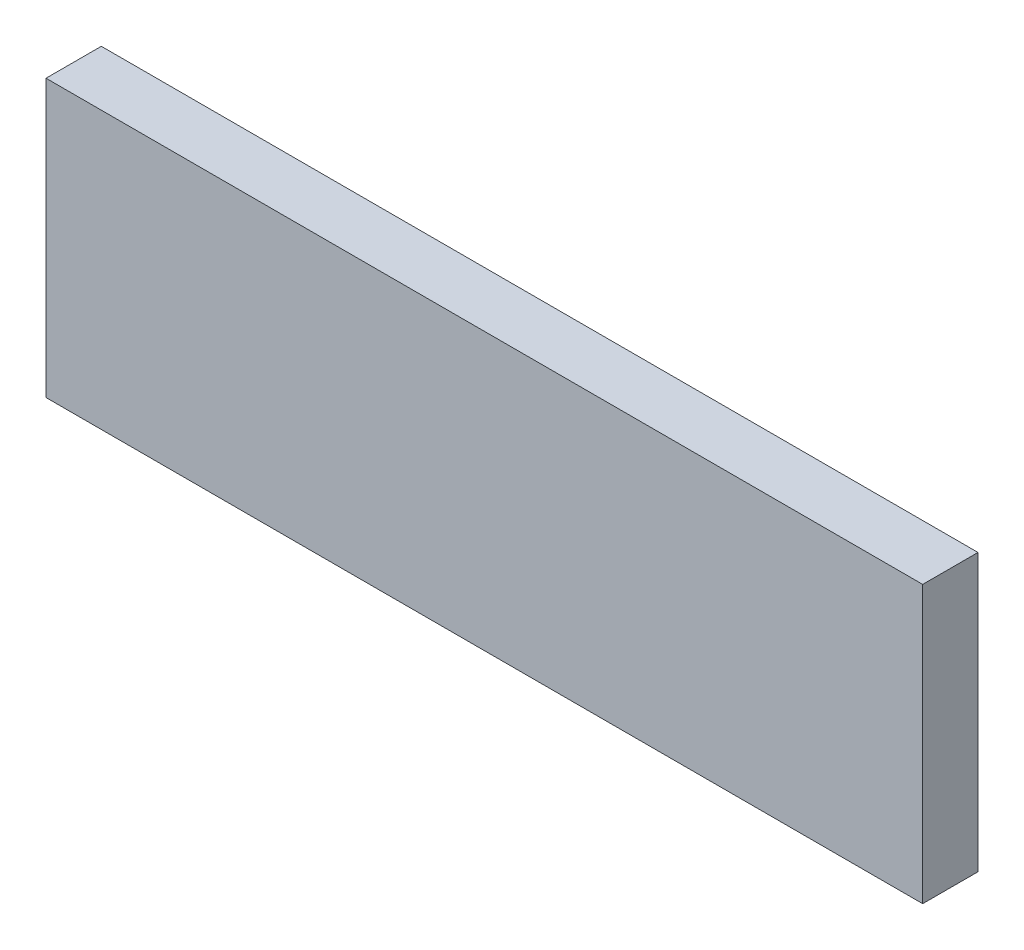
ISO-10303-21;
HEADER;
FILE_DESCRIPTION(('STEP AP214'),'2;1');
FILE_NAME('part.step','',(''),(''),'','','');
FILE_SCHEMA(('AUTOMOTIVE_DESIGN { 1 0 10303 214 1 1 1 1 }'));
ENDSEC;
DATA;
#1=APPLICATION_CONTEXT('core data for automotive mechanical design processes');
#2=APPLICATION_PROTOCOL_DEFINITION('international standard','automotive_design',2000,#1);
#3=PRODUCT_CONTEXT('',#1,'mechanical');
#4=PRODUCT('Part','Part','',(#3));
#5=PRODUCT_RELATED_PRODUCT_CATEGORY('part','',(#4));
#6=PRODUCT_DEFINITION_FORMATION('','',#4);
#7=PRODUCT_DEFINITION_CONTEXT('part definition',#1,'design');
#8=PRODUCT_DEFINITION('design','',#6,#7);
#9=PRODUCT_DEFINITION_SHAPE('','',#8);
#10=(LENGTH_UNIT() NAMED_UNIT(*) SI_UNIT(.MILLI.,.METRE.));
#11=(NAMED_UNIT(*) PLANE_ANGLE_UNIT() SI_UNIT($,.RADIAN.));
#12=(NAMED_UNIT(*) SI_UNIT($,.STERADIAN.) SOLID_ANGLE_UNIT());
#13=UNCERTAINTY_MEASURE_WITH_UNIT(LENGTH_MEASURE(1.E-05),#10,'distance_accuracy_value','');
#14=(GEOMETRIC_REPRESENTATION_CONTEXT(3) GLOBAL_UNCERTAINTY_ASSIGNED_CONTEXT((#13)) GLOBAL_UNIT_ASSIGNED_CONTEXT((#10,
#11,#12)) REPRESENTATION_CONTEXT('',''));
#15=CARTESIAN_POINT('',(0.,0.,0.));
#16=DIRECTION('',(0.,0.,1.));
#17=DIRECTION('',(1.,0.,0.));
#18=AXIS2_PLACEMENT_3D('',#15,#16,#17);
#19=CARTESIAN_POINT('',(0.,100.,0.));
#20=DIRECTION('',(1.,0.,0.));
#21=DIRECTION('',(0.,0.,-1.));
#22=AXIS2_PLACEMENT_3D('',#19,#20,#21);
#23=PLANE('',#22);
#24=DIRECTION('',(0.,0.,1.));
#25=VECTOR('',#24,1.);
#26=CARTESIAN_POINT('',(0.,0.,0.));
#27=LINE('',#26,#25);
#28=CARTESIAN_POINT('',(0.,0.,0.));
#29=VERTEX_POINT('',#28);
#30=CARTESIAN_POINT('',(0.,0.,20.));
#31=VERTEX_POINT('',#30);
#32=EDGE_CURVE('E107',#29,#31,#27,.T.);
#33=ORIENTED_EDGE('',*,*,#32,.T.);
#34=DIRECTION('',(0.,-1.,0.));
#35=VECTOR('',#34,1.);
#36=CARTESIAN_POINT('',(0.,100.,20.));
#37=LINE('',#36,#35);
#38=CARTESIAN_POINT('',(0.,100.,20.));
#39=VERTEX_POINT('',#38);
#40=EDGE_CURVE('E11',#39,#31,#37,.T.);
#41=ORIENTED_EDGE('',*,*,#40,.F.);
#42=DIRECTION('',(0.,0.,1.));
#43=VECTOR('',#42,1.);
#44=CARTESIAN_POINT('',(0.,100.,0.));
#45=LINE('',#44,#43);
#46=CARTESIAN_POINT('',(0.,100.,0.));
#47=VERTEX_POINT('',#46);
#48=EDGE_CURVE('E91',#47,#39,#45,.T.);
#49=ORIENTED_EDGE('',*,*,#48,.F.);
#50=DIRECTION('',(0.,-1.,0.));
#51=VECTOR('',#50,1.);
#52=CARTESIAN_POINT('',(0.,100.,0.));
#53=LINE('',#52,#51);
#54=EDGE_CURVE('E103',#47,#29,#53,.T.);
#55=ORIENTED_EDGE('',*,*,#54,.T.);
#56=EDGE_LOOP('',(#33,#41,#49,#55));
#57=FACE_BOUND('',#56,.T.);
#58=ADVANCED_FACE('F39',(#57),#23,.F.);
#59=CARTESIAN_POINT('',(0.,100.,20.));
#60=DIRECTION('',(0.,0.,-1.));
#61=DIRECTION('',(-1.,0.,0.));
#62=AXIS2_PLACEMENT_3D('',#59,#60,#61);
#63=PLANE('',#62);
#64=DIRECTION('',(1.,0.,0.));
#65=VECTOR('',#64,1.);
#66=CARTESIAN_POINT('',(0.,0.,20.));
#67=LINE('',#66,#65);
#68=CARTESIAN_POINT('',(317.,0.,20.));
#69=VERTEX_POINT('',#68);
#70=EDGE_CURVE('E96',#31,#69,#67,.T.);
#71=ORIENTED_EDGE('',*,*,#70,.T.);
#72=DIRECTION('',(0.,-1.,0.));
#73=VECTOR('',#72,1.);
#74=CARTESIAN_POINT('',(317.,100.,20.));
#75=LINE('',#74,#73);
#76=CARTESIAN_POINT('',(317.,100.,20.));
#77=VERTEX_POINT('',#76);
#78=EDGE_CURVE('E48',#77,#69,#75,.T.);
#79=ORIENTED_EDGE('',*,*,#78,.F.);
#80=DIRECTION('',(1.,0.,0.));
#81=VECTOR('',#80,1.);
#82=CARTESIAN_POINT('',(0.,100.,20.));
#83=LINE('',#82,#81);
#84=EDGE_CURVE('E86',#39,#77,#83,.T.);
#85=ORIENTED_EDGE('',*,*,#84,.F.);
#86=ORIENTED_EDGE('',*,*,#40,.T.);
#87=EDGE_LOOP('',(#71,#79,#85,#86));
#88=FACE_BOUND('',#87,.T.);
#89=ADVANCED_FACE('F95',(#88),#63,.F.);
#90=CARTESIAN_POINT('',(317.,100.,0.));
#91=DIRECTION('',(-1.,0.,0.));
#92=DIRECTION('',(0.,0.,1.));
#93=AXIS2_PLACEMENT_3D('',#90,#91,#92);
#94=PLANE('',#93);
#95=DIRECTION('',(0.,0.,-1.));
#96=VECTOR('',#95,1.);
#97=CARTESIAN_POINT('',(317.,0.,0.));
#98=LINE('',#97,#96);
#99=CARTESIAN_POINT('',(317.,0.,0.));
#100=VERTEX_POINT('',#99);
#101=EDGE_CURVE('E73',#69,#100,#98,.T.);
#102=ORIENTED_EDGE('',*,*,#101,.T.);
#103=DIRECTION('',(0.,-1.,0.));
#104=VECTOR('',#103,1.);
#105=CARTESIAN_POINT('',(317.,100.,0.));
#106=LINE('',#105,#104);
#107=CARTESIAN_POINT('',(317.,100.,0.));
#108=VERTEX_POINT('',#107);
#109=EDGE_CURVE('E98',#108,#100,#106,.T.);
#110=ORIENTED_EDGE('',*,*,#109,.F.);
#111=DIRECTION('',(0.,0.,-1.));
#112=VECTOR('',#111,1.);
#113=CARTESIAN_POINT('',(317.,100.,0.));
#114=LINE('',#113,#112);
#115=EDGE_CURVE('E89',#77,#108,#114,.T.);
#116=ORIENTED_EDGE('',*,*,#115,.F.);
#117=ORIENTED_EDGE('',*,*,#78,.T.);
#118=EDGE_LOOP('',(#102,#110,#116,#117));
#119=FACE_BOUND('',#118,.T.);
#120=ADVANCED_FACE('F99',(#119),#94,.F.);
#121=CARTESIAN_POINT('',(0.,100.,0.));
#122=DIRECTION('',(0.,0.,1.));
#123=DIRECTION('',(1.,0.,0.));
#124=AXIS2_PLACEMENT_3D('',#121,#122,#123);
#125=PLANE('',#124);
#126=DIRECTION('',(-1.,0.,0.));
#127=VECTOR('',#126,1.);
#128=CARTESIAN_POINT('',(0.,0.,0.));
#129=LINE('',#128,#127);
#130=EDGE_CURVE('E79',#100,#29,#129,.T.);
#131=ORIENTED_EDGE('',*,*,#130,.T.);
#132=ORIENTED_EDGE('',*,*,#54,.F.);
#133=DIRECTION('',(-1.,0.,0.));
#134=VECTOR('',#133,1.);
#135=CARTESIAN_POINT('',(0.,100.,0.));
#136=LINE('',#135,#134);
#137=EDGE_CURVE('E56',#108,#47,#136,.T.);
#138=ORIENTED_EDGE('',*,*,#137,.F.);
#139=ORIENTED_EDGE('',*,*,#109,.T.);
#140=EDGE_LOOP('',(#131,#132,#138,#139));
#141=FACE_BOUND('',#140,.T.);
#142=ADVANCED_FACE('F120',(#141),#125,.F.);
#143=CARTESIAN_POINT('',(0.,100.,0.));
#144=DIRECTION('',(0.,1.,0.));
#145=DIRECTION('',(0.,0.,1.));
#146=AXIS2_PLACEMENT_3D('',#143,#144,#145);
#147=PLANE('',#146);
#148=ORIENTED_EDGE('',*,*,#48,.T.);
#149=ORIENTED_EDGE('',*,*,#84,.T.);
#150=ORIENTED_EDGE('',*,*,#115,.T.);
#151=ORIENTED_EDGE('',*,*,#137,.T.);
#152=EDGE_LOOP('',(#148,#149,#150,#151));
#153=FACE_BOUND('',#152,.T.);
#154=ADVANCED_FACE('F87',(#153),#147,.T.);
#155=CARTESIAN_POINT('',(0.,0.,0.));
#156=DIRECTION('',(0.,1.,0.));
#157=DIRECTION('',(0.,0.,1.));
#158=AXIS2_PLACEMENT_3D('',#155,#156,#157);
#159=PLANE('',#158);
#160=ORIENTED_EDGE('',*,*,#32,.F.);
#161=ORIENTED_EDGE('',*,*,#130,.F.);
#162=ORIENTED_EDGE('',*,*,#101,.F.);
#163=ORIENTED_EDGE('',*,*,#70,.F.);
#164=EDGE_LOOP('',(#160,#161,#162,#163));
#165=FACE_BOUND('',#164,.T.);
#166=ADVANCED_FACE('F123',(#165),#159,.F.);
#167=CLOSED_SHELL('',(#58,#89,#120,#142,#154,#166));
#168=MANIFOLD_SOLID_BREP('B2',#167);
#169=ADVANCED_BREP_SHAPE_REPRESENTATION('',(#18,#168),#14);
#170=SHAPE_DEFINITION_REPRESENTATION(#9,#169);
ENDSEC;
END-ISO-10303-21;
